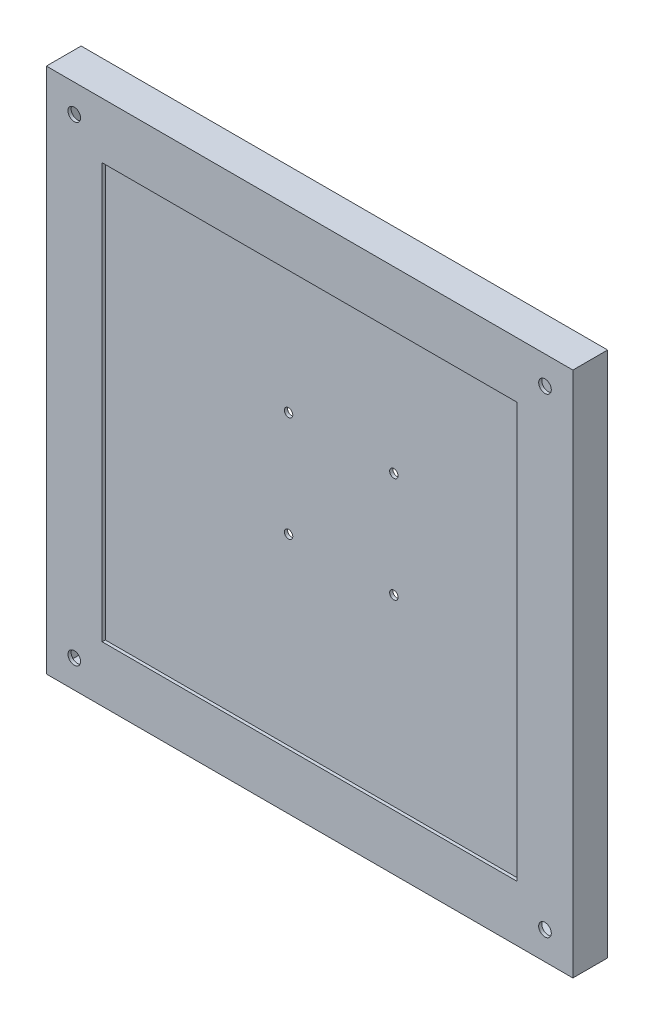
ISO-10303-21;
HEADER;
FILE_DESCRIPTION(('STEP AP214'),'2;1');
FILE_NAME('part.step','',(''),(''),'','','');
FILE_SCHEMA(('AUTOMOTIVE_DESIGN { 1 0 10303 214 1 1 1 1 }'));
ENDSEC;
DATA;
#1=APPLICATION_CONTEXT('core data for automotive mechanical design processes');
#2=APPLICATION_PROTOCOL_DEFINITION('international standard','automotive_design',2000,#1);
#3=PRODUCT_CONTEXT('',#1,'mechanical');
#4=PRODUCT('Part','Part','',(#3));
#5=PRODUCT_RELATED_PRODUCT_CATEGORY('part','',(#4));
#6=PRODUCT_DEFINITION_FORMATION('','',#4);
#7=PRODUCT_DEFINITION_CONTEXT('part definition',#1,'design');
#8=PRODUCT_DEFINITION('design','',#6,#7);
#9=PRODUCT_DEFINITION_SHAPE('','',#8);
#10=(LENGTH_UNIT() NAMED_UNIT(*) SI_UNIT(.MILLI.,.METRE.));
#11=(NAMED_UNIT(*) PLANE_ANGLE_UNIT() SI_UNIT($,.RADIAN.));
#12=(NAMED_UNIT(*) SI_UNIT($,.STERADIAN.) SOLID_ANGLE_UNIT());
#13=UNCERTAINTY_MEASURE_WITH_UNIT(LENGTH_MEASURE(1.E-05),#10,'distance_accuracy_value','');
#14=(GEOMETRIC_REPRESENTATION_CONTEXT(3) GLOBAL_UNCERTAINTY_ASSIGNED_CONTEXT((#13)) GLOBAL_UNIT_ASSIGNED_CONTEXT((#10,
#11,#12)) REPRESENTATION_CONTEXT('',''));
#15=CARTESIAN_POINT('',(0.,0.,0.));
#16=DIRECTION('',(0.,0.,1.));
#17=DIRECTION('',(1.,0.,0.));
#18=AXIS2_PLACEMENT_3D('',#15,#16,#17);
#19=CARTESIAN_POINT('',(-247.,247.,33.));
#20=DIRECTION('',(0.,-1.,0.));
#21=DIRECTION('',(0.,0.,-1.));
#22=AXIS2_PLACEMENT_3D('',#19,#20,#21);
#23=PLANE('',#22);
#24=DIRECTION('',(0.,0.,-1.));
#25=VECTOR('',#24,1.);
#26=CARTESIAN_POINT('',(247.,247.,33.));
#27=LINE('',#26,#25);
#28=CARTESIAN_POINT('',(247.,247.,30.));
#29=VERTEX_POINT('',#28);
#30=CARTESIAN_POINT('',(247.,247.,3.));
#31=VERTEX_POINT('',#30);
#32=EDGE_CURVE('E60',#29,#31,#27,.T.);
#33=ORIENTED_EDGE('',*,*,#32,.F.);
#34=DIRECTION('',(-1.,0.,0.));
#35=VECTOR('',#34,1.);
#36=CARTESIAN_POINT('',(-247.,247.,30.));
#37=LINE('',#36,#35);
#38=CARTESIAN_POINT('',(-247.,247.,30.));
#39=VERTEX_POINT('',#38);
#40=EDGE_CURVE('E53',#29,#39,#37,.T.);
#41=ORIENTED_EDGE('',*,*,#40,.T.);
#42=DIRECTION('',(0.,0.,-1.));
#43=VECTOR('',#42,1.);
#44=CARTESIAN_POINT('',(-247.,247.,33.));
#45=LINE('',#44,#43);
#46=CARTESIAN_POINT('',(-247.,247.,3.));
#47=VERTEX_POINT('',#46);
#48=EDGE_CURVE('E199',#39,#47,#45,.T.);
#49=ORIENTED_EDGE('',*,*,#48,.T.);
#50=DIRECTION('',(-1.,0.,0.));
#51=VECTOR('',#50,1.);
#52=CARTESIAN_POINT('',(-247.,247.,3.));
#53=LINE('',#52,#51);
#54=EDGE_CURVE('E182',#31,#47,#53,.T.);
#55=ORIENTED_EDGE('',*,*,#54,.F.);
#56=EDGE_LOOP('',(#33,#41,#49,#55));
#57=FACE_BOUND('',#56,.T.);
#58=ADVANCED_FACE('F38',(#57),#23,.T.);
#59=CARTESIAN_POINT('',(-247.,247.,33.));
#60=DIRECTION('',(1.,0.,0.));
#61=DIRECTION('',(0.,1.,0.));
#62=AXIS2_PLACEMENT_3D('',#59,#60,#61);
#63=PLANE('',#62);
#64=ORIENTED_EDGE('',*,*,#48,.F.);
#65=DIRECTION('',(0.,-1.,0.));
#66=VECTOR('',#65,1.);
#67=CARTESIAN_POINT('',(-247.,247.,30.));
#68=LINE('',#67,#66);
#69=CARTESIAN_POINT('',(-247.,-247.,30.));
#70=VERTEX_POINT('',#69);
#71=EDGE_CURVE('E170',#39,#70,#68,.T.);
#72=ORIENTED_EDGE('',*,*,#71,.T.);
#73=DIRECTION('',(0.,0.,-1.));
#74=VECTOR('',#73,1.);
#75=CARTESIAN_POINT('',(-247.,-247.,33.));
#76=LINE('',#75,#74);
#77=CARTESIAN_POINT('',(-247.,-247.,3.));
#78=VERTEX_POINT('',#77);
#79=EDGE_CURVE('E197',#70,#78,#76,.T.);
#80=ORIENTED_EDGE('',*,*,#79,.T.);
#81=DIRECTION('',(0.,-1.,0.));
#82=VECTOR('',#81,1.);
#83=CARTESIAN_POINT('',(-247.,247.,3.));
#84=LINE('',#83,#82);
#85=EDGE_CURVE('E185',#47,#78,#84,.T.);
#86=ORIENTED_EDGE('',*,*,#85,.F.);
#87=EDGE_LOOP('',(#64,#72,#80,#86));
#88=FACE_BOUND('',#87,.T.);
#89=ADVANCED_FACE('F279',(#88),#63,.T.);
#90=CARTESIAN_POINT('',(-247.,-247.,33.));
#91=DIRECTION('',(0.,1.,0.));
#92=DIRECTION('',(0.,0.,1.));
#93=AXIS2_PLACEMENT_3D('',#90,#91,#92);
#94=PLANE('',#93);
#95=ORIENTED_EDGE('',*,*,#79,.F.);
#96=DIRECTION('',(1.,0.,0.));
#97=VECTOR('',#96,1.);
#98=CARTESIAN_POINT('',(-247.,-247.,30.));
#99=LINE('',#98,#97);
#100=CARTESIAN_POINT('',(247.,-247.,30.));
#101=VERTEX_POINT('',#100);
#102=EDGE_CURVE('E176',#70,#101,#99,.T.);
#103=ORIENTED_EDGE('',*,*,#102,.T.);
#104=DIRECTION('',(0.,0.,-1.));
#105=VECTOR('',#104,1.);
#106=CARTESIAN_POINT('',(247.,-247.,33.));
#107=LINE('',#106,#105);
#108=CARTESIAN_POINT('',(247.,-247.,3.));
#109=VERTEX_POINT('',#108);
#110=EDGE_CURVE('E195',#101,#109,#107,.T.);
#111=ORIENTED_EDGE('',*,*,#110,.T.);
#112=DIRECTION('',(1.,0.,0.));
#113=VECTOR('',#112,1.);
#114=CARTESIAN_POINT('',(-247.,-247.,3.));
#115=LINE('',#114,#113);
#116=EDGE_CURVE('E188',#78,#109,#115,.T.);
#117=ORIENTED_EDGE('',*,*,#116,.F.);
#118=EDGE_LOOP('',(#95,#103,#111,#117));
#119=FACE_BOUND('',#118,.T.);
#120=ADVANCED_FACE('F285',(#119),#94,.T.);
#121=CARTESIAN_POINT('',(247.,247.,33.));
#122=DIRECTION('',(-1.,0.,0.));
#123=DIRECTION('',(0.,-1.,0.));
#124=AXIS2_PLACEMENT_3D('',#121,#122,#123);
#125=PLANE('',#124);
#126=ORIENTED_EDGE('',*,*,#110,.F.);
#127=DIRECTION('',(0.,1.,0.));
#128=VECTOR('',#127,1.);
#129=CARTESIAN_POINT('',(247.,247.,30.));
#130=LINE('',#129,#128);
#131=EDGE_CURVE('E179',#101,#29,#130,.T.);
#132=ORIENTED_EDGE('',*,*,#131,.T.);
#133=ORIENTED_EDGE('',*,*,#32,.T.);
#134=DIRECTION('',(0.,1.,0.));
#135=VECTOR('',#134,1.);
#136=CARTESIAN_POINT('',(247.,247.,3.));
#137=LINE('',#136,#135);
#138=EDGE_CURVE('E191',#109,#31,#137,.T.);
#139=ORIENTED_EDGE('',*,*,#138,.F.);
#140=EDGE_LOOP('',(#126,#132,#133,#139));
#141=FACE_BOUND('',#140,.T.);
#142=ADVANCED_FACE('F277',(#141),#125,.T.);
#143=CARTESIAN_POINT('',(250.,-250.,3.));
#144=DIRECTION('',(-1.,0.,0.));
#145=DIRECTION('',(0.,0.,1.));
#146=AXIS2_PLACEMENT_3D('',#143,#144,#145);
#147=PLANE('',#146);
#148=DIRECTION('',(0.,1.,0.));
#149=VECTOR('',#148,1.);
#150=CARTESIAN_POINT('',(250.,-250.,0.));
#151=LINE('',#150,#149);
#152=CARTESIAN_POINT('',(250.,-250.,0.));
#153=VERTEX_POINT('',#152);
#154=CARTESIAN_POINT('',(250.,250.,0.));
#155=VERTEX_POINT('',#154);
#156=EDGE_CURVE('E237',#153,#155,#151,.T.);
#157=ORIENTED_EDGE('',*,*,#156,.T.);
#158=DIRECTION('',(0.,0.,-1.));
#159=VECTOR('',#158,1.);
#160=CARTESIAN_POINT('',(250.,250.,3.));
#161=LINE('',#160,#159);
#162=CARTESIAN_POINT('',(250.,250.,33.));
#163=VERTEX_POINT('',#162);
#164=EDGE_CURVE('E11',#163,#155,#161,.T.);
#165=ORIENTED_EDGE('',*,*,#164,.F.);
#166=DIRECTION('',(0.,1.,0.));
#167=VECTOR('',#166,1.);
#168=CARTESIAN_POINT('',(250.,250.,33.));
#169=LINE('',#168,#167);
#170=CARTESIAN_POINT('',(250.,-250.,33.));
#171=VERTEX_POINT('',#170);
#172=EDGE_CURVE('E207',#171,#163,#169,.T.);
#173=ORIENTED_EDGE('',*,*,#172,.F.);
#174=DIRECTION('',(0.,0.,-1.));
#175=VECTOR('',#174,1.);
#176=CARTESIAN_POINT('',(250.,-250.,3.));
#177=LINE('',#176,#175);
#178=EDGE_CURVE('E246',#171,#153,#177,.T.);
#179=ORIENTED_EDGE('',*,*,#178,.T.);
#180=EDGE_LOOP('',(#157,#165,#173,#179));
#181=FACE_BOUND('',#180,.T.);
#182=ADVANCED_FACE('F40',(#181),#147,.F.);
#183=CARTESIAN_POINT('',(-250.,250.,3.));
#184=DIRECTION('',(0.,-1.,0.));
#185=DIRECTION('',(0.,0.,-1.));
#186=AXIS2_PLACEMENT_3D('',#183,#184,#185);
#187=PLANE('',#186);
#188=DIRECTION('',(-1.,0.,0.));
#189=VECTOR('',#188,1.);
#190=CARTESIAN_POINT('',(-250.,250.,0.));
#191=LINE('',#190,#189);
#192=CARTESIAN_POINT('',(-250.,250.,0.));
#193=VERTEX_POINT('',#192);
#194=EDGE_CURVE('E240',#155,#193,#191,.T.);
#195=ORIENTED_EDGE('',*,*,#194,.T.);
#196=DIRECTION('',(0.,0.,-1.));
#197=VECTOR('',#196,1.);
#198=CARTESIAN_POINT('',(-250.,250.,3.));
#199=LINE('',#198,#197);
#200=CARTESIAN_POINT('',(-250.,250.,33.));
#201=VERTEX_POINT('',#200);
#202=EDGE_CURVE('E46',#201,#193,#199,.T.);
#203=ORIENTED_EDGE('',*,*,#202,.F.);
#204=DIRECTION('',(-1.,0.,0.));
#205=VECTOR('',#204,1.);
#206=CARTESIAN_POINT('',(250.,250.,33.));
#207=LINE('',#206,#205);
#208=EDGE_CURVE('E210',#163,#201,#207,.T.);
#209=ORIENTED_EDGE('',*,*,#208,.F.);
#210=ORIENTED_EDGE('',*,*,#164,.T.);
#211=EDGE_LOOP('',(#195,#203,#209,#210));
#212=FACE_BOUND('',#211,.T.);
#213=ADVANCED_FACE('F270',(#212),#187,.F.);
#214=CARTESIAN_POINT('',(-250.,-250.,3.));
#215=DIRECTION('',(1.,0.,0.));
#216=DIRECTION('',(0.,0.,-1.));
#217=AXIS2_PLACEMENT_3D('',#214,#215,#216);
#218=PLANE('',#217);
#219=DIRECTION('',(0.,-1.,0.));
#220=VECTOR('',#219,1.);
#221=CARTESIAN_POINT('',(-250.,-250.,0.));
#222=LINE('',#221,#220);
#223=CARTESIAN_POINT('',(-250.,-250.,0.));
#224=VERTEX_POINT('',#223);
#225=EDGE_CURVE('E242',#193,#224,#222,.T.);
#226=ORIENTED_EDGE('',*,*,#225,.T.);
#227=DIRECTION('',(0.,0.,-1.));
#228=VECTOR('',#227,1.);
#229=CARTESIAN_POINT('',(-250.,-250.,3.));
#230=LINE('',#229,#228);
#231=CARTESIAN_POINT('',(-250.,-250.,33.));
#232=VERTEX_POINT('',#231);
#233=EDGE_CURVE('E249',#232,#224,#230,.T.);
#234=ORIENTED_EDGE('',*,*,#233,.F.);
#235=DIRECTION('',(0.,-1.,0.));
#236=VECTOR('',#235,1.);
#237=CARTESIAN_POINT('',(-250.,250.,33.));
#238=LINE('',#237,#236);
#239=EDGE_CURVE('E201',#201,#232,#238,.T.);
#240=ORIENTED_EDGE('',*,*,#239,.F.);
#241=ORIENTED_EDGE('',*,*,#202,.T.);
#242=EDGE_LOOP('',(#226,#234,#240,#241));
#243=FACE_BOUND('',#242,.T.);
#244=ADVANCED_FACE('F255',(#243),#218,.F.);
#245=CARTESIAN_POINT('',(-250.,-250.,3.));
#246=DIRECTION('',(0.,1.,0.));
#247=DIRECTION('',(0.,0.,1.));
#248=AXIS2_PLACEMENT_3D('',#245,#246,#247);
#249=PLANE('',#248);
#250=DIRECTION('',(1.,0.,0.));
#251=VECTOR('',#250,1.);
#252=CARTESIAN_POINT('',(-250.,-250.,0.));
#253=LINE('',#252,#251);
#254=EDGE_CURVE('E244',#224,#153,#253,.T.);
#255=ORIENTED_EDGE('',*,*,#254,.T.);
#256=ORIENTED_EDGE('',*,*,#178,.F.);
#257=DIRECTION('',(1.,0.,0.));
#258=VECTOR('',#257,1.);
#259=CARTESIAN_POINT('',(250.,-250.,33.));
#260=LINE('',#259,#258);
#261=EDGE_CURVE('E204',#232,#171,#260,.T.);
#262=ORIENTED_EDGE('',*,*,#261,.F.);
#263=ORIENTED_EDGE('',*,*,#233,.T.);
#264=EDGE_LOOP('',(#255,#256,#262,#263));
#265=FACE_BOUND('',#264,.T.);
#266=ADVANCED_FACE('F263',(#265),#249,.F.);
#267=CARTESIAN_POINT('',(0.,0.,3.));
#268=DIRECTION('',(0.,0.,-1.));
#269=DIRECTION('',(-1.,0.,0.));
#270=AXIS2_PLACEMENT_3D('',#267,#268,#269);
#271=PLANE('',#270);
#272=ORIENTED_EDGE('',*,*,#138,.T.);
#273=ORIENTED_EDGE('',*,*,#54,.T.);
#274=ORIENTED_EDGE('',*,*,#85,.T.);
#275=ORIENTED_EDGE('',*,*,#116,.T.);
#276=EDGE_LOOP('',(#272,#273,#274,#275));
#277=FACE_BOUND('',#276,.T.);
#278=CARTESIAN_POINT('',(50.,50.,3.));
#279=DIRECTION('',(0.,0.,-1.));
#280=DIRECTION('',(-1.,0.,0.));
#281=AXIS2_PLACEMENT_3D('',#278,#279,#280);
#282=CIRCLE('',#281,4.00000000000001);
#283=CARTESIAN_POINT('',(46.,50.,3.));
#284=VERTEX_POINT('',#283);
#285=EDGE_CURVE('E223',#284,#284,#282,.F.);
#286=ORIENTED_EDGE('',*,*,#285,.F.);
#287=EDGE_LOOP('',(#286));
#288=FACE_BOUND('',#287,.T.);
#289=CARTESIAN_POINT('',(-50.,-50.,3.));
#290=DIRECTION('',(0.,0.,-1.));
#291=DIRECTION('',(-1.,0.,0.));
#292=AXIS2_PLACEMENT_3D('',#289,#290,#291);
#293=CIRCLE('',#292,4.00000000000001);
#294=CARTESIAN_POINT('',(-54.,-50.,3.));
#295=VERTEX_POINT('',#294);
#296=EDGE_CURVE('E224',#295,#295,#293,.F.);
#297=ORIENTED_EDGE('',*,*,#296,.F.);
#298=EDGE_LOOP('',(#297));
#299=FACE_BOUND('',#298,.T.);
#300=CARTESIAN_POINT('',(50.,-50.,3.));
#301=DIRECTION('',(0.,0.,-1.));
#302=DIRECTION('',(-1.,0.,0.));
#303=AXIS2_PLACEMENT_3D('',#300,#301,#302);
#304=CIRCLE('',#303,4.00000000000001);
#305=CARTESIAN_POINT('',(46.,-50.,3.));
#306=VERTEX_POINT('',#305);
#307=EDGE_CURVE('E216',#306,#306,#304,.F.);
#308=ORIENTED_EDGE('',*,*,#307,.F.);
#309=EDGE_LOOP('',(#308));
#310=FACE_BOUND('',#309,.T.);
#311=CARTESIAN_POINT('',(-50.,50.,3.));
#312=DIRECTION('',(0.,0.,-1.));
#313=DIRECTION('',(-1.,0.,0.));
#314=AXIS2_PLACEMENT_3D('',#311,#312,#313);
#315=CIRCLE('',#314,4.00000000000001);
#316=CARTESIAN_POINT('',(-54.,50.,3.));
#317=VERTEX_POINT('',#316);
#318=EDGE_CURVE('E234',#317,#317,#315,.F.);
#319=ORIENTED_EDGE('',*,*,#318,.F.);
#320=EDGE_LOOP('',(#319));
#321=FACE_BOUND('',#320,.T.);
#322=ADVANCED_FACE('F309',(#277,#288,#299,#310,#321),#271,.F.);
#323=CARTESIAN_POINT('',(0.,0.,0.));
#324=DIRECTION('',(0.,0.,-1.));
#325=DIRECTION('',(-1.,0.,0.));
#326=AXIS2_PLACEMENT_3D('',#323,#324,#325);
#327=PLANE('',#326);
#328=CARTESIAN_POINT('',(50.,50.,0.));
#329=DIRECTION('',(0.,0.,-1.));
#330=DIRECTION('',(1.,0.,0.));
#331=AXIS2_PLACEMENT_3D('',#328,#329,#330);
#332=CIRCLE('',#331,4.00000000000001);
#333=CARTESIAN_POINT('',(46.,50.,0.));
#334=VERTEX_POINT('',#333);
#335=EDGE_CURVE('E220',#334,#334,#332,.T.);
#336=ORIENTED_EDGE('',*,*,#335,.F.);
#337=EDGE_LOOP('',(#336));
#338=FACE_BOUND('',#337,.T.);
#339=CARTESIAN_POINT('',(-50.,-50.,0.));
#340=DIRECTION('',(0.,0.,-1.));
#341=DIRECTION('',(1.,0.,0.));
#342=AXIS2_PLACEMENT_3D('',#339,#340,#341);
#343=CIRCLE('',#342,4.00000000000001);
#344=CARTESIAN_POINT('',(-54.,-50.,0.));
#345=VERTEX_POINT('',#344);
#346=EDGE_CURVE('E219',#345,#345,#343,.T.);
#347=ORIENTED_EDGE('',*,*,#346,.F.);
#348=EDGE_LOOP('',(#347));
#349=FACE_BOUND('',#348,.T.);
#350=CARTESIAN_POINT('',(50.,-50.,0.));
#351=DIRECTION('',(0.,0.,-1.));
#352=DIRECTION('',(-1.,0.,0.));
#353=AXIS2_PLACEMENT_3D('',#350,#351,#352);
#354=CIRCLE('',#353,4.00000000000001);
#355=CARTESIAN_POINT('',(46.,-50.,0.));
#356=VERTEX_POINT('',#355);
#357=EDGE_CURVE('E213',#356,#356,#354,.T.);
#358=ORIENTED_EDGE('',*,*,#357,.F.);
#359=EDGE_LOOP('',(#358));
#360=FACE_BOUND('',#359,.T.);
#361=CARTESIAN_POINT('',(-50.,50.,0.));
#362=DIRECTION('',(0.,0.,-1.));
#363=DIRECTION('',(-1.,0.,0.));
#364=AXIS2_PLACEMENT_3D('',#361,#362,#363);
#365=CIRCLE('',#364,4.00000000000001);
#366=CARTESIAN_POINT('',(-54.,50.,0.));
#367=VERTEX_POINT('',#366);
#368=EDGE_CURVE('E227',#367,#367,#365,.T.);
#369=ORIENTED_EDGE('',*,*,#368,.F.);
#370=EDGE_LOOP('',(#369));
#371=FACE_BOUND('',#370,.T.);
#372=ORIENTED_EDGE('',*,*,#156,.F.);
#373=ORIENTED_EDGE('',*,*,#254,.F.);
#374=ORIENTED_EDGE('',*,*,#225,.F.);
#375=ORIENTED_EDGE('',*,*,#194,.F.);
#376=EDGE_LOOP('',(#372,#373,#374,#375));
#377=FACE_BOUND('',#376,.T.);
#378=ADVANCED_FACE('F261',(#338,#349,#360,#371,#377),#327,.T.);
#379=CARTESIAN_POINT('',(-50.,50.,3.001));
#380=DIRECTION('',(0.,0.,-1.));
#381=DIRECTION('',(-1.,0.,0.));
#382=AXIS2_PLACEMENT_3D('',#379,#380,#381);
#383=CYLINDRICAL_SURFACE('',#382,4.00000000000001);
#384=CARTESIAN_POINT('',(-54.,50.,0.));
#385=CARTESIAN_POINT('',(-54.,50.,0.0312500000000005));
#386=CARTESIAN_POINT('',(-54.,50.,0.0625000000000005));
#387=CARTESIAN_POINT('',(-54.,50.,0.125000000000001));
#388=CARTESIAN_POINT('',(-54.,50.,0.156250000000001));
#389=CARTESIAN_POINT('',(-54.,50.,0.218750000000001));
#390=CARTESIAN_POINT('',(-54.,50.,0.250000000000001));
#391=CARTESIAN_POINT('',(-54.,50.,0.312500000000001));
#392=CARTESIAN_POINT('',(-54.,50.,0.34375));
#393=CARTESIAN_POINT('',(-54.,50.,0.40625));
#394=CARTESIAN_POINT('',(-54.,50.,0.4375));
#395=CARTESIAN_POINT('',(-54.,50.,0.5));
#396=CARTESIAN_POINT('',(-54.,50.,0.53125));
#397=CARTESIAN_POINT('',(-54.,50.,0.593750000000001));
#398=CARTESIAN_POINT('',(-54.,50.,0.625000000000001));
#399=CARTESIAN_POINT('',(-54.,50.,0.687500000000001));
#400=CARTESIAN_POINT('',(-54.,50.,0.71875));
#401=CARTESIAN_POINT('',(-54.,50.,0.78125));
#402=CARTESIAN_POINT('',(-54.,50.,0.8125));
#403=CARTESIAN_POINT('',(-54.,50.,0.875));
#404=CARTESIAN_POINT('',(-54.,50.,0.90625));
#405=CARTESIAN_POINT('',(-54.,50.,0.96875));
#406=CARTESIAN_POINT('',(-54.,50.,1.));
#407=CARTESIAN_POINT('',(-54.,50.,1.0625));
#408=CARTESIAN_POINT('',(-54.,50.,1.09375));
#409=CARTESIAN_POINT('',(-54.,50.,1.15625));
#410=CARTESIAN_POINT('',(-54.,50.,1.1875));
#411=CARTESIAN_POINT('',(-54.,50.,1.25));
#412=CARTESIAN_POINT('',(-54.,50.,1.28125));
#413=CARTESIAN_POINT('',(-54.,50.,1.34375));
#414=CARTESIAN_POINT('',(-54.,50.,1.375));
#415=CARTESIAN_POINT('',(-54.,50.,1.4375));
#416=CARTESIAN_POINT('',(-54.,50.,1.46875));
#417=CARTESIAN_POINT('',(-54.,50.,1.53125));
#418=CARTESIAN_POINT('',(-54.,50.,1.5625));
#419=CARTESIAN_POINT('',(-54.,50.,1.625));
#420=CARTESIAN_POINT('',(-54.,50.,1.65625));
#421=CARTESIAN_POINT('',(-54.,50.,1.71875));
#422=CARTESIAN_POINT('',(-54.,50.,1.75));
#423=CARTESIAN_POINT('',(-54.,50.,1.8125));
#424=CARTESIAN_POINT('',(-54.,50.,1.84375));
#425=CARTESIAN_POINT('',(-54.,50.,1.90625));
#426=CARTESIAN_POINT('',(-54.,50.,1.9375));
#427=CARTESIAN_POINT('',(-54.,50.,2.));
#428=CARTESIAN_POINT('',(-54.,50.,2.03125));
#429=CARTESIAN_POINT('',(-54.,50.,2.09375));
#430=CARTESIAN_POINT('',(-54.,50.,2.125));
#431=CARTESIAN_POINT('',(-54.,50.,2.1875));
#432=CARTESIAN_POINT('',(-54.,50.,2.21875));
#433=CARTESIAN_POINT('',(-54.,50.,2.28125));
#434=CARTESIAN_POINT('',(-54.,50.,2.3125));
#435=CARTESIAN_POINT('',(-54.,50.,2.375));
#436=CARTESIAN_POINT('',(-54.,50.,2.40625));
#437=CARTESIAN_POINT('',(-54.,50.,2.46875));
#438=CARTESIAN_POINT('',(-54.,50.,2.5));
#439=CARTESIAN_POINT('',(-54.,50.,2.5625));
#440=CARTESIAN_POINT('',(-54.,50.,2.59375));
#441=CARTESIAN_POINT('',(-54.,50.,2.65625));
#442=CARTESIAN_POINT('',(-54.,50.,2.6875));
#443=CARTESIAN_POINT('',(-54.,50.,2.75));
#444=CARTESIAN_POINT('',(-54.,50.,2.78125));
#445=CARTESIAN_POINT('',(-54.,50.,2.84375));
#446=CARTESIAN_POINT('',(-54.,50.,2.875));
#447=CARTESIAN_POINT('',(-54.,50.,2.9375));
#448=CARTESIAN_POINT('',(-54.,50.,2.96875));
#449=CARTESIAN_POINT('',(-54.,50.,3.));
#450=B_SPLINE_CURVE_WITH_KNOTS('',3,(#384,#385,#386,#387,#388,#389,#390,#391,#392,#393,#394,
#395,#396,#397,#398,#399,#400,#401,#402,#403,#404,#405,#406,#407,#408,#409,#410,#411,#412,#413,
#414,#415,#416,#417,#418,#419,#420,#421,#422,#423,#424,#425,#426,#427,#428,#429,#430,#431,#432,
#433,#434,#435,#436,#437,#438,#439,#440,#441,#442,#443,#444,#445,#446,#447,#448,#449),
.UNSPECIFIED.,.F.,.F.,(4,2,2,2,2,2,2,2,2,2,2,2,2,2,2,2,2,2,2,2,2,2,2,2,2,2,2,2,2,2,2,2,4),(0.,
0.0937500000000001,0.1875,0.28125,0.375,0.46875,0.5625,0.65625,0.75,0.84375,0.9375,1.03125,
1.125,1.21875,1.3125,1.40625,1.5,1.59375,1.6875,1.78125,1.875,1.96875,2.0625,2.15625,2.25,
2.34375,2.4375,2.53125,2.625,2.71875,2.8125,2.90625,3.),.UNSPECIFIED.);
#451=EDGE_CURVE('BSEAM298',#367,#317,#450,.T.);
#452=ORIENTED_EDGE('',*,*,#368,.T.);
#453=ORIENTED_EDGE('',*,*,#318,.T.);
#454=ORIENTED_EDGE('',*,*,#451,.T.);
#455=ORIENTED_EDGE('',*,*,#451,.F.);
#456=EDGE_LOOP('',(#452,#454,#453,#455));
#457=FACE_BOUND('',#456,.T.);
#458=ADVANCED_FACE('F298',(#457),#383,.F.);
#459=CARTESIAN_POINT('',(50.,-50.,3.001));
#460=DIRECTION('',(0.,0.,-1.));
#461=DIRECTION('',(-1.,0.,0.));
#462=AXIS2_PLACEMENT_3D('',#459,#460,#461);
#463=CYLINDRICAL_SURFACE('',#462,4.00000000000001);
#464=CARTESIAN_POINT('',(46.,-50.,0.));
#465=CARTESIAN_POINT('',(46.,-50.,0.0312500000000005));
#466=CARTESIAN_POINT('',(46.,-50.,0.0625000000000005));
#467=CARTESIAN_POINT('',(46.,-50.,0.125000000000001));
#468=CARTESIAN_POINT('',(46.,-50.,0.156250000000001));
#469=CARTESIAN_POINT('',(46.,-50.,0.218750000000001));
#470=CARTESIAN_POINT('',(46.,-50.,0.250000000000001));
#471=CARTESIAN_POINT('',(46.,-50.,0.312500000000001));
#472=CARTESIAN_POINT('',(46.,-50.,0.34375));
#473=CARTESIAN_POINT('',(46.,-50.,0.40625));
#474=CARTESIAN_POINT('',(46.,-50.,0.4375));
#475=CARTESIAN_POINT('',(46.,-50.,0.5));
#476=CARTESIAN_POINT('',(46.,-50.,0.53125));
#477=CARTESIAN_POINT('',(46.,-50.,0.593750000000001));
#478=CARTESIAN_POINT('',(46.,-50.,0.625000000000001));
#479=CARTESIAN_POINT('',(46.,-50.,0.687500000000001));
#480=CARTESIAN_POINT('',(46.,-50.,0.71875));
#481=CARTESIAN_POINT('',(46.,-50.,0.78125));
#482=CARTESIAN_POINT('',(46.,-50.,0.8125));
#483=CARTESIAN_POINT('',(46.,-50.,0.875));
#484=CARTESIAN_POINT('',(46.,-50.,0.90625));
#485=CARTESIAN_POINT('',(46.,-50.,0.96875));
#486=CARTESIAN_POINT('',(46.,-50.,1.));
#487=CARTESIAN_POINT('',(46.,-50.,1.0625));
#488=CARTESIAN_POINT('',(46.,-50.,1.09375));
#489=CARTESIAN_POINT('',(46.,-50.,1.15625));
#490=CARTESIAN_POINT('',(46.,-50.,1.1875));
#491=CARTESIAN_POINT('',(46.,-50.,1.25));
#492=CARTESIAN_POINT('',(46.,-50.,1.28125));
#493=CARTESIAN_POINT('',(46.,-50.,1.34375));
#494=CARTESIAN_POINT('',(46.,-50.,1.375));
#495=CARTESIAN_POINT('',(46.,-50.,1.4375));
#496=CARTESIAN_POINT('',(46.,-50.,1.46875));
#497=CARTESIAN_POINT('',(46.,-50.,1.53125));
#498=CARTESIAN_POINT('',(46.,-50.,1.5625));
#499=CARTESIAN_POINT('',(46.,-50.,1.625));
#500=CARTESIAN_POINT('',(46.,-50.,1.65625));
#501=CARTESIAN_POINT('',(46.,-50.,1.71875));
#502=CARTESIAN_POINT('',(46.,-50.,1.75));
#503=CARTESIAN_POINT('',(46.,-50.,1.8125));
#504=CARTESIAN_POINT('',(46.,-50.,1.84375));
#505=CARTESIAN_POINT('',(46.,-50.,1.90625));
#506=CARTESIAN_POINT('',(46.,-50.,1.9375));
#507=CARTESIAN_POINT('',(46.,-50.,2.));
#508=CARTESIAN_POINT('',(46.,-50.,2.03125));
#509=CARTESIAN_POINT('',(46.,-50.,2.09375));
#510=CARTESIAN_POINT('',(46.,-50.,2.125));
#511=CARTESIAN_POINT('',(46.,-50.,2.1875));
#512=CARTESIAN_POINT('',(46.,-50.,2.21875));
#513=CARTESIAN_POINT('',(46.,-50.,2.28125));
#514=CARTESIAN_POINT('',(46.,-50.,2.3125));
#515=CARTESIAN_POINT('',(46.,-50.,2.375));
#516=CARTESIAN_POINT('',(46.,-50.,2.40625));
#517=CARTESIAN_POINT('',(46.,-50.,2.46875));
#518=CARTESIAN_POINT('',(46.,-50.,2.5));
#519=CARTESIAN_POINT('',(46.,-50.,2.5625));
#520=CARTESIAN_POINT('',(46.,-50.,2.59375));
#521=CARTESIAN_POINT('',(46.,-50.,2.65625));
#522=CARTESIAN_POINT('',(46.,-50.,2.6875));
#523=CARTESIAN_POINT('',(46.,-50.,2.75));
#524=CARTESIAN_POINT('',(46.,-50.,2.78125));
#525=CARTESIAN_POINT('',(46.,-50.,2.84375));
#526=CARTESIAN_POINT('',(46.,-50.,2.875));
#527=CARTESIAN_POINT('',(46.,-50.,2.9375));
#528=CARTESIAN_POINT('',(46.,-50.,2.96875));
#529=CARTESIAN_POINT('',(46.,-50.,3.));
#530=B_SPLINE_CURVE_WITH_KNOTS('',3,(#464,#465,#466,#467,#468,#469,#470,#471,#472,#473,#474,
#475,#476,#477,#478,#479,#480,#481,#482,#483,#484,#485,#486,#487,#488,#489,#490,#491,#492,#493,
#494,#495,#496,#497,#498,#499,#500,#501,#502,#503,#504,#505,#506,#507,#508,#509,#510,#511,#512,
#513,#514,#515,#516,#517,#518,#519,#520,#521,#522,#523,#524,#525,#526,#527,#528,#529),
.UNSPECIFIED.,.F.,.F.,(4,2,2,2,2,2,2,2,2,2,2,2,2,2,2,2,2,2,2,2,2,2,2,2,2,2,2,2,2,2,2,2,4),(0.,
0.0937500000000001,0.1875,0.28125,0.375,0.46875,0.5625,0.65625,0.75,0.84375,0.9375,1.03125,
1.125,1.21875,1.3125,1.40625,1.5,1.59375,1.6875,1.78125,1.875,1.96875,2.0625,2.15625,2.25,
2.34375,2.4375,2.53125,2.625,2.71875,2.8125,2.90625,3.),.UNSPECIFIED.);
#531=EDGE_CURVE('BSEAM294',#356,#306,#530,.T.);
#532=ORIENTED_EDGE('',*,*,#357,.T.);
#533=ORIENTED_EDGE('',*,*,#307,.T.);
#534=ORIENTED_EDGE('',*,*,#531,.T.);
#535=ORIENTED_EDGE('',*,*,#531,.F.);
#536=EDGE_LOOP('',(#532,#534,#533,#535));
#537=FACE_BOUND('',#536,.T.);
#538=ADVANCED_FACE('F294',(#537),#463,.F.);
#539=CARTESIAN_POINT('',(-50.,-50.,3.001));
#540=DIRECTION('',(0.,0.,-1.));
#541=DIRECTION('',(-1.,0.,0.));
#542=AXIS2_PLACEMENT_3D('',#539,#540,#541);
#543=CYLINDRICAL_SURFACE('',#542,4.00000000000001);
#544=CARTESIAN_POINT('',(-54.,-50.,0.));
#545=CARTESIAN_POINT('',(-54.,-50.,0.0312500000000005));
#546=CARTESIAN_POINT('',(-54.,-50.,0.0625000000000005));
#547=CARTESIAN_POINT('',(-54.,-50.,0.125000000000001));
#548=CARTESIAN_POINT('',(-54.,-50.,0.156250000000001));
#549=CARTESIAN_POINT('',(-54.,-50.,0.218750000000001));
#550=CARTESIAN_POINT('',(-54.,-50.,0.250000000000001));
#551=CARTESIAN_POINT('',(-54.,-50.,0.312500000000001));
#552=CARTESIAN_POINT('',(-54.,-50.,0.34375));
#553=CARTESIAN_POINT('',(-54.,-50.,0.40625));
#554=CARTESIAN_POINT('',(-54.,-50.,0.4375));
#555=CARTESIAN_POINT('',(-54.,-50.,0.5));
#556=CARTESIAN_POINT('',(-54.,-50.,0.53125));
#557=CARTESIAN_POINT('',(-54.,-50.,0.593750000000001));
#558=CARTESIAN_POINT('',(-54.,-50.,0.625000000000001));
#559=CARTESIAN_POINT('',(-54.,-50.,0.687500000000001));
#560=CARTESIAN_POINT('',(-54.,-50.,0.71875));
#561=CARTESIAN_POINT('',(-54.,-50.,0.78125));
#562=CARTESIAN_POINT('',(-54.,-50.,0.8125));
#563=CARTESIAN_POINT('',(-54.,-50.,0.875));
#564=CARTESIAN_POINT('',(-54.,-50.,0.90625));
#565=CARTESIAN_POINT('',(-54.,-50.,0.96875));
#566=CARTESIAN_POINT('',(-54.,-50.,1.));
#567=CARTESIAN_POINT('',(-54.,-50.,1.0625));
#568=CARTESIAN_POINT('',(-54.,-50.,1.09375));
#569=CARTESIAN_POINT('',(-54.,-50.,1.15625));
#570=CARTESIAN_POINT('',(-54.,-50.,1.1875));
#571=CARTESIAN_POINT('',(-54.,-50.,1.25));
#572=CARTESIAN_POINT('',(-54.,-50.,1.28125));
#573=CARTESIAN_POINT('',(-54.,-50.,1.34375));
#574=CARTESIAN_POINT('',(-54.,-50.,1.375));
#575=CARTESIAN_POINT('',(-54.,-50.,1.4375));
#576=CARTESIAN_POINT('',(-54.,-50.,1.46875));
#577=CARTESIAN_POINT('',(-54.,-50.,1.53125));
#578=CARTESIAN_POINT('',(-54.,-50.,1.5625));
#579=CARTESIAN_POINT('',(-54.,-50.,1.625));
#580=CARTESIAN_POINT('',(-54.,-50.,1.65625));
#581=CARTESIAN_POINT('',(-54.,-50.,1.71875));
#582=CARTESIAN_POINT('',(-54.,-50.,1.75));
#583=CARTESIAN_POINT('',(-54.,-50.,1.8125));
#584=CARTESIAN_POINT('',(-54.,-50.,1.84375));
#585=CARTESIAN_POINT('',(-54.,-50.,1.90625));
#586=CARTESIAN_POINT('',(-54.,-50.,1.9375));
#587=CARTESIAN_POINT('',(-54.,-50.,2.));
#588=CARTESIAN_POINT('',(-54.,-50.,2.03125));
#589=CARTESIAN_POINT('',(-54.,-50.,2.09375));
#590=CARTESIAN_POINT('',(-54.,-50.,2.125));
#591=CARTESIAN_POINT('',(-54.,-50.,2.1875));
#592=CARTESIAN_POINT('',(-54.,-50.,2.21875));
#593=CARTESIAN_POINT('',(-54.,-50.,2.28125));
#594=CARTESIAN_POINT('',(-54.,-50.,2.3125));
#595=CARTESIAN_POINT('',(-54.,-50.,2.375));
#596=CARTESIAN_POINT('',(-54.,-50.,2.40625));
#597=CARTESIAN_POINT('',(-54.,-50.,2.46875));
#598=CARTESIAN_POINT('',(-54.,-50.,2.5));
#599=CARTESIAN_POINT('',(-54.,-50.,2.5625));
#600=CARTESIAN_POINT('',(-54.,-50.,2.59375));
#601=CARTESIAN_POINT('',(-54.,-50.,2.65625));
#602=CARTESIAN_POINT('',(-54.,-50.,2.6875));
#603=CARTESIAN_POINT('',(-54.,-50.,2.75));
#604=CARTESIAN_POINT('',(-54.,-50.,2.78125));
#605=CARTESIAN_POINT('',(-54.,-50.,2.84375));
#606=CARTESIAN_POINT('',(-54.,-50.,2.875));
#607=CARTESIAN_POINT('',(-54.,-50.,2.9375));
#608=CARTESIAN_POINT('',(-54.,-50.,2.96875));
#609=CARTESIAN_POINT('',(-54.,-50.,3.));
#610=B_SPLINE_CURVE_WITH_KNOTS('',3,(#544,#545,#546,#547,#548,#549,#550,#551,#552,#553,#554,
#555,#556,#557,#558,#559,#560,#561,#562,#563,#564,#565,#566,#567,#568,#569,#570,#571,#572,#573,
#574,#575,#576,#577,#578,#579,#580,#581,#582,#583,#584,#585,#586,#587,#588,#589,#590,#591,#592,
#593,#594,#595,#596,#597,#598,#599,#600,#601,#602,#603,#604,#605,#606,#607,#608,#609),
.UNSPECIFIED.,.F.,.F.,(4,2,2,2,2,2,2,2,2,2,2,2,2,2,2,2,2,2,2,2,2,2,2,2,2,2,2,2,2,2,2,2,4),(0.,
0.0937500000000001,0.1875,0.28125,0.375,0.46875,0.5625,0.65625,0.75,0.84375,0.9375,1.03125,
1.125,1.21875,1.3125,1.40625,1.5,1.59375,1.6875,1.78125,1.875,1.96875,2.0625,2.15625,2.25,
2.34375,2.4375,2.53125,2.625,2.71875,2.8125,2.90625,3.),.UNSPECIFIED.);
#611=EDGE_CURVE('BSEAM297',#345,#295,#610,.T.);
#612=ORIENTED_EDGE('',*,*,#346,.T.);
#613=ORIENTED_EDGE('',*,*,#296,.T.);
#614=ORIENTED_EDGE('',*,*,#611,.T.);
#615=ORIENTED_EDGE('',*,*,#611,.F.);
#616=EDGE_LOOP('',(#612,#614,#613,#615));
#617=FACE_BOUND('',#616,.T.);
#618=ADVANCED_FACE('F297',(#617),#543,.F.);
#619=CARTESIAN_POINT('',(50.,50.,3.001));
#620=DIRECTION('',(0.,0.,-1.));
#621=DIRECTION('',(-1.,0.,0.));
#622=AXIS2_PLACEMENT_3D('',#619,#620,#621);
#623=CYLINDRICAL_SURFACE('',#622,4.00000000000001);
#624=CARTESIAN_POINT('',(46.,50.,0.));
#625=CARTESIAN_POINT('',(46.,50.,0.0312500000000005));
#626=CARTESIAN_POINT('',(46.,50.,0.0625000000000005));
#627=CARTESIAN_POINT('',(46.,50.,0.125000000000001));
#628=CARTESIAN_POINT('',(46.,50.,0.156250000000001));
#629=CARTESIAN_POINT('',(46.,50.,0.218750000000001));
#630=CARTESIAN_POINT('',(46.,50.,0.250000000000001));
#631=CARTESIAN_POINT('',(46.,50.,0.312500000000001));
#632=CARTESIAN_POINT('',(46.,50.,0.34375));
#633=CARTESIAN_POINT('',(46.,50.,0.40625));
#634=CARTESIAN_POINT('',(46.,50.,0.4375));
#635=CARTESIAN_POINT('',(46.,50.,0.5));
#636=CARTESIAN_POINT('',(46.,50.,0.53125));
#637=CARTESIAN_POINT('',(46.,50.,0.593750000000001));
#638=CARTESIAN_POINT('',(46.,50.,0.625000000000001));
#639=CARTESIAN_POINT('',(46.,50.,0.687500000000001));
#640=CARTESIAN_POINT('',(46.,50.,0.71875));
#641=CARTESIAN_POINT('',(46.,50.,0.78125));
#642=CARTESIAN_POINT('',(46.,50.,0.8125));
#643=CARTESIAN_POINT('',(46.,50.,0.875));
#644=CARTESIAN_POINT('',(46.,50.,0.90625));
#645=CARTESIAN_POINT('',(46.,50.,0.96875));
#646=CARTESIAN_POINT('',(46.,50.,1.));
#647=CARTESIAN_POINT('',(46.,50.,1.0625));
#648=CARTESIAN_POINT('',(46.,50.,1.09375));
#649=CARTESIAN_POINT('',(46.,50.,1.15625));
#650=CARTESIAN_POINT('',(46.,50.,1.1875));
#651=CARTESIAN_POINT('',(46.,50.,1.25));
#652=CARTESIAN_POINT('',(46.,50.,1.28125));
#653=CARTESIAN_POINT('',(46.,50.,1.34375));
#654=CARTESIAN_POINT('',(46.,50.,1.375));
#655=CARTESIAN_POINT('',(46.,50.,1.4375));
#656=CARTESIAN_POINT('',(46.,50.,1.46875));
#657=CARTESIAN_POINT('',(46.,50.,1.53125));
#658=CARTESIAN_POINT('',(46.,50.,1.5625));
#659=CARTESIAN_POINT('',(46.,50.,1.625));
#660=CARTESIAN_POINT('',(46.,50.,1.65625));
#661=CARTESIAN_POINT('',(46.,50.,1.71875));
#662=CARTESIAN_POINT('',(46.,50.,1.75));
#663=CARTESIAN_POINT('',(46.,50.,1.8125));
#664=CARTESIAN_POINT('',(46.,50.,1.84375));
#665=CARTESIAN_POINT('',(46.,50.,1.90625));
#666=CARTESIAN_POINT('',(46.,50.,1.9375));
#667=CARTESIAN_POINT('',(46.,50.,2.));
#668=CARTESIAN_POINT('',(46.,50.,2.03125));
#669=CARTESIAN_POINT('',(46.,50.,2.09375));
#670=CARTESIAN_POINT('',(46.,50.,2.125));
#671=CARTESIAN_POINT('',(46.,50.,2.1875));
#672=CARTESIAN_POINT('',(46.,50.,2.21875));
#673=CARTESIAN_POINT('',(46.,50.,2.28125));
#674=CARTESIAN_POINT('',(46.,50.,2.3125));
#675=CARTESIAN_POINT('',(46.,50.,2.375));
#676=CARTESIAN_POINT('',(46.,50.,2.40625));
#677=CARTESIAN_POINT('',(46.,50.,2.46875));
#678=CARTESIAN_POINT('',(46.,50.,2.5));
#679=CARTESIAN_POINT('',(46.,50.,2.5625));
#680=CARTESIAN_POINT('',(46.,50.,2.59375));
#681=CARTESIAN_POINT('',(46.,50.,2.65625));
#682=CARTESIAN_POINT('',(46.,50.,2.6875));
#683=CARTESIAN_POINT('',(46.,50.,2.75));
#684=CARTESIAN_POINT('',(46.,50.,2.78125));
#685=CARTESIAN_POINT('',(46.,50.,2.84375));
#686=CARTESIAN_POINT('',(46.,50.,2.875));
#687=CARTESIAN_POINT('',(46.,50.,2.9375));
#688=CARTESIAN_POINT('',(46.,50.,2.96875));
#689=CARTESIAN_POINT('',(46.,50.,3.));
#690=B_SPLINE_CURVE_WITH_KNOTS('',3,(#624,#625,#626,#627,#628,#629,#630,#631,#632,#633,#634,
#635,#636,#637,#638,#639,#640,#641,#642,#643,#644,#645,#646,#647,#648,#649,#650,#651,#652,#653,
#654,#655,#656,#657,#658,#659,#660,#661,#662,#663,#664,#665,#666,#667,#668,#669,#670,#671,#672,
#673,#674,#675,#676,#677,#678,#679,#680,#681,#682,#683,#684,#685,#686,#687,#688,#689),
.UNSPECIFIED.,.F.,.F.,(4,2,2,2,2,2,2,2,2,2,2,2,2,2,2,2,2,2,2,2,2,2,2,2,2,2,2,2,2,2,2,2,4),(0.,
0.0937500000000001,0.1875,0.28125,0.375,0.46875,0.5625,0.65625,0.75,0.84375,0.9375,1.03125,
1.125,1.21875,1.3125,1.40625,1.5,1.59375,1.6875,1.78125,1.875,1.96875,2.0625,2.15625,2.25,
2.34375,2.4375,2.53125,2.625,2.71875,2.8125,2.90625,3.),.UNSPECIFIED.);
#691=EDGE_CURVE('BSEAM292',#334,#284,#690,.T.);
#692=ORIENTED_EDGE('',*,*,#335,.T.);
#693=ORIENTED_EDGE('',*,*,#285,.T.);
#694=ORIENTED_EDGE('',*,*,#691,.T.);
#695=ORIENTED_EDGE('',*,*,#691,.F.);
#696=EDGE_LOOP('',(#692,#694,#693,#695));
#697=FACE_BOUND('',#696,.T.);
#698=ADVANCED_FACE('F292',(#697),#623,.F.);
#699=CARTESIAN_POINT('',(0.,0.,33.));
#700=DIRECTION('',(0.,0.,-1.));
#701=DIRECTION('',(-1.,0.,0.));
#702=AXIS2_PLACEMENT_3D('',#699,#700,#701);
#703=PLANE('',#702);
#704=CARTESIAN_POINT('',(-223.5,-223.5,33.));
#705=DIRECTION('',(0.,0.,1.));
#706=DIRECTION('',(-1.,0.,0.));
#707=AXIS2_PLACEMENT_3D('',#704,#705,#706);
#708=CIRCLE('',#707,6.00000000000002);
#709=CARTESIAN_POINT('',(-229.5,-223.5,33.));
#710=VERTEX_POINT('',#709);
#711=EDGE_CURVE('E527',#710,#710,#708,.T.);
#712=ORIENTED_EDGE('',*,*,#711,.F.);
#713=EDGE_LOOP('',(#712));
#714=FACE_BOUND('',#713,.T.);
#715=CARTESIAN_POINT('',(223.5,-223.5,33.));
#716=DIRECTION('',(0.,0.,1.));
#717=DIRECTION('',(1.,0.,0.));
#718=AXIS2_PLACEMENT_3D('',#715,#716,#717);
#719=CIRCLE('',#718,6.00000000000002);
#720=CARTESIAN_POINT('',(229.5,-223.5,33.));
#721=VERTEX_POINT('',#720);
#722=EDGE_CURVE('E531',#721,#721,#719,.T.);
#723=ORIENTED_EDGE('',*,*,#722,.F.);
#724=EDGE_LOOP('',(#723));
#725=FACE_BOUND('',#724,.T.);
#726=CARTESIAN_POINT('',(223.5,223.5,33.));
#727=DIRECTION('',(0.,0.,1.));
#728=DIRECTION('',(-1.,0.,0.));
#729=AXIS2_PLACEMENT_3D('',#726,#727,#728);
#730=CIRCLE('',#729,6.00000000000002);
#731=CARTESIAN_POINT('',(217.5,223.5,33.));
#732=VERTEX_POINT('',#731);
#733=EDGE_CURVE('E544',#732,#732,#730,.T.);
#734=ORIENTED_EDGE('',*,*,#733,.F.);
#735=EDGE_LOOP('',(#734));
#736=FACE_BOUND('',#735,.T.);
#737=CARTESIAN_POINT('',(-223.5,223.5,33.));
#738=DIRECTION('',(0.,0.,1.));
#739=DIRECTION('',(1.,0.,0.));
#740=AXIS2_PLACEMENT_3D('',#737,#738,#739);
#741=CIRCLE('',#740,6.00000000000002);
#742=CARTESIAN_POINT('',(-217.5,223.5,33.));
#743=VERTEX_POINT('',#742);
#744=EDGE_CURVE('E538',#743,#743,#741,.T.);
#745=ORIENTED_EDGE('',*,*,#744,.F.);
#746=EDGE_LOOP('',(#745));
#747=FACE_BOUND('',#746,.T.);
#748=ORIENTED_EDGE('',*,*,#239,.T.);
#749=ORIENTED_EDGE('',*,*,#261,.T.);
#750=ORIENTED_EDGE('',*,*,#172,.T.);
#751=ORIENTED_EDGE('',*,*,#208,.T.);
#752=EDGE_LOOP('',(#748,#749,#750,#751));
#753=FACE_BOUND('',#752,.T.);
#754=DIRECTION('',(-1.,0.,0.));
#755=VECTOR('',#754,1.);
#756=CARTESIAN_POINT('',(-197.,197.,33.));
#757=LINE('',#756,#755);
#758=CARTESIAN_POINT('',(197.,197.,33.));
#759=VERTEX_POINT('',#758);
#760=CARTESIAN_POINT('',(-197.,197.,33.));
#761=VERTEX_POINT('',#760);
#762=EDGE_CURVE('E135',#759,#761,#757,.T.);
#763=ORIENTED_EDGE('',*,*,#762,.F.);
#764=DIRECTION('',(0.,1.,0.));
#765=VECTOR('',#764,1.);
#766=CARTESIAN_POINT('',(197.,197.,33.));
#767=LINE('',#766,#765);
#768=CARTESIAN_POINT('',(197.,-197.,33.));
#769=VERTEX_POINT('',#768);
#770=EDGE_CURVE('E152',#769,#759,#767,.T.);
#771=ORIENTED_EDGE('',*,*,#770,.F.);
#772=DIRECTION('',(1.,0.,0.));
#773=VECTOR('',#772,1.);
#774=CARTESIAN_POINT('',(-197.,-197.,33.));
#775=LINE('',#774,#773);
#776=CARTESIAN_POINT('',(-197.,-197.,33.));
#777=VERTEX_POINT('',#776);
#778=EDGE_CURVE('E155',#777,#769,#775,.T.);
#779=ORIENTED_EDGE('',*,*,#778,.F.);
#780=DIRECTION('',(0.,-1.,0.));
#781=VECTOR('',#780,1.);
#782=CARTESIAN_POINT('',(-197.,197.,33.));
#783=LINE('',#782,#781);
#784=EDGE_CURVE('E164',#761,#777,#783,.T.);
#785=ORIENTED_EDGE('',*,*,#784,.F.);
#786=EDGE_LOOP('',(#763,#771,#779,#785));
#787=FACE_BOUND('',#786,.T.);
#788=ADVANCED_FACE('F268',(#714,#725,#736,#747,#753,#787),#703,.F.);
#789=CARTESIAN_POINT('',(0.,0.,30.));
#790=DIRECTION('',(0.,0.,1.));
#791=DIRECTION('',(1.,0.,0.));
#792=AXIS2_PLACEMENT_3D('',#789,#790,#791);
#793=PLANE('',#792);
#794=CARTESIAN_POINT('',(-223.5,-223.5,30.));
#795=DIRECTION('',(0.,0.,1.));
#796=DIRECTION('',(1.,0.,0.));
#797=AXIS2_PLACEMENT_3D('',#794,#795,#796);
#798=CIRCLE('',#797,6.00000000000002);
#799=CARTESIAN_POINT('',(-217.5,-223.5,30.));
#800=VERTEX_POINT('',#799);
#801=EDGE_CURVE('E530',#800,#800,#798,.F.);
#802=ORIENTED_EDGE('',*,*,#801,.F.);
#803=EDGE_LOOP('',(#802));
#804=FACE_BOUND('',#803,.T.);
#805=CARTESIAN_POINT('',(223.5,-223.5,30.));
#806=DIRECTION('',(0.,0.,1.));
#807=DIRECTION('',(1.,0.,0.));
#808=AXIS2_PLACEMENT_3D('',#805,#806,#807);
#809=CIRCLE('',#808,6.00000000000002);
#810=CARTESIAN_POINT('',(229.5,-223.5,30.));
#811=VERTEX_POINT('',#810);
#812=EDGE_CURVE('E534',#811,#811,#809,.F.);
#813=ORIENTED_EDGE('',*,*,#812,.F.);
#814=EDGE_LOOP('',(#813));
#815=FACE_BOUND('',#814,.T.);
#816=CARTESIAN_POINT('',(223.5,223.5,30.));
#817=DIRECTION('',(0.,0.,1.));
#818=DIRECTION('',(1.,0.,0.));
#819=AXIS2_PLACEMENT_3D('',#816,#817,#818);
#820=CIRCLE('',#819,6.00000000000002);
#821=CARTESIAN_POINT('',(229.5,223.5,30.));
#822=VERTEX_POINT('',#821);
#823=EDGE_CURVE('E540',#822,#822,#820,.F.);
#824=ORIENTED_EDGE('',*,*,#823,.F.);
#825=EDGE_LOOP('',(#824));
#826=FACE_BOUND('',#825,.T.);
#827=CARTESIAN_POINT('',(-223.5,223.5,30.));
#828=DIRECTION('',(0.,0.,1.));
#829=DIRECTION('',(1.,0.,0.));
#830=AXIS2_PLACEMENT_3D('',#827,#828,#829);
#831=CIRCLE('',#830,6.00000000000002);
#832=CARTESIAN_POINT('',(-217.5,223.5,30.));
#833=VERTEX_POINT('',#832);
#834=EDGE_CURVE('E158',#833,#833,#831,.F.);
#835=ORIENTED_EDGE('',*,*,#834,.F.);
#836=EDGE_LOOP('',(#835));
#837=FACE_BOUND('',#836,.T.);
#838=DIRECTION('',(0.,1.,0.));
#839=VECTOR('',#838,1.);
#840=CARTESIAN_POINT('',(197.,197.,30.));
#841=LINE('',#840,#839);
#842=CARTESIAN_POINT('',(197.,-197.,30.));
#843=VERTEX_POINT('',#842);
#844=CARTESIAN_POINT('',(197.,197.,30.));
#845=VERTEX_POINT('',#844);
#846=EDGE_CURVE('E140',#843,#845,#841,.T.);
#847=ORIENTED_EDGE('',*,*,#846,.T.);
#848=DIRECTION('',(-1.,0.,0.));
#849=VECTOR('',#848,1.);
#850=CARTESIAN_POINT('',(-197.,197.,30.));
#851=LINE('',#850,#849);
#852=CARTESIAN_POINT('',(-197.,197.,30.));
#853=VERTEX_POINT('',#852);
#854=EDGE_CURVE('E132',#845,#853,#851,.T.);
#855=ORIENTED_EDGE('',*,*,#854,.T.);
#856=DIRECTION('',(0.,-1.,0.));
#857=VECTOR('',#856,1.);
#858=CARTESIAN_POINT('',(-197.,197.,30.));
#859=LINE('',#858,#857);
#860=CARTESIAN_POINT('',(-197.,-197.,30.));
#861=VERTEX_POINT('',#860);
#862=EDGE_CURVE('E144',#853,#861,#859,.T.);
#863=ORIENTED_EDGE('',*,*,#862,.T.);
#864=DIRECTION('',(1.,0.,0.));
#865=VECTOR('',#864,1.);
#866=CARTESIAN_POINT('',(-197.,-197.,30.));
#867=LINE('',#866,#865);
#868=EDGE_CURVE('E148',#861,#843,#867,.T.);
#869=ORIENTED_EDGE('',*,*,#868,.T.);
#870=EDGE_LOOP('',(#847,#855,#863,#869));
#871=FACE_BOUND('',#870,.T.);
#872=ORIENTED_EDGE('',*,*,#71,.F.);
#873=ORIENTED_EDGE('',*,*,#40,.F.);
#874=ORIENTED_EDGE('',*,*,#131,.F.);
#875=ORIENTED_EDGE('',*,*,#102,.F.);
#876=EDGE_LOOP('',(#872,#873,#874,#875));
#877=FACE_BOUND('',#876,.T.);
#878=ADVANCED_FACE('F150',(#804,#815,#826,#837,#871,#877),#793,.F.);
#879=CARTESIAN_POINT('',(-197.,197.,30.));
#880=DIRECTION('',(0.,1.,0.));
#881=DIRECTION('',(0.,0.,1.));
#882=AXIS2_PLACEMENT_3D('',#879,#880,#881);
#883=PLANE('',#882);
#884=ORIENTED_EDGE('',*,*,#762,.T.);
#885=DIRECTION('',(0.,0.,1.));
#886=VECTOR('',#885,1.);
#887=CARTESIAN_POINT('',(-197.,197.,30.));
#888=LINE('',#887,#886);
#889=EDGE_CURVE('E128',#853,#761,#888,.T.);
#890=ORIENTED_EDGE('',*,*,#889,.F.);
#891=ORIENTED_EDGE('',*,*,#854,.F.);
#892=DIRECTION('',(0.,0.,1.));
#893=VECTOR('',#892,1.);
#894=CARTESIAN_POINT('',(197.,197.,30.));
#895=LINE('',#894,#893);
#896=EDGE_CURVE('E168',#845,#759,#895,.T.);
#897=ORIENTED_EDGE('',*,*,#896,.T.);
#898=EDGE_LOOP('',(#884,#890,#891,#897));
#899=FACE_BOUND('',#898,.T.);
#900=ADVANCED_FACE('F130',(#899),#883,.F.);
#901=CARTESIAN_POINT('',(197.,197.,30.));
#902=DIRECTION('',(1.,0.,0.));
#903=DIRECTION('',(0.,1.,0.));
#904=AXIS2_PLACEMENT_3D('',#901,#902,#903);
#905=PLANE('',#904);
#906=ORIENTED_EDGE('',*,*,#770,.T.);
#907=ORIENTED_EDGE('',*,*,#896,.F.);
#908=ORIENTED_EDGE('',*,*,#846,.F.);
#909=DIRECTION('',(0.,0.,1.));
#910=VECTOR('',#909,1.);
#911=CARTESIAN_POINT('',(197.,-197.,30.));
#912=LINE('',#911,#910);
#913=EDGE_CURVE('E171',#843,#769,#912,.T.);
#914=ORIENTED_EDGE('',*,*,#913,.T.);
#915=EDGE_LOOP('',(#906,#907,#908,#914));
#916=FACE_BOUND('',#915,.T.);
#917=ADVANCED_FACE('F365',(#916),#905,.F.);
#918=CARTESIAN_POINT('',(-197.,-197.,30.));
#919=DIRECTION('',(0.,-1.,0.));
#920=DIRECTION('',(0.,0.,-1.));
#921=AXIS2_PLACEMENT_3D('',#918,#919,#920);
#922=PLANE('',#921);
#923=ORIENTED_EDGE('',*,*,#778,.T.);
#924=ORIENTED_EDGE('',*,*,#913,.F.);
#925=ORIENTED_EDGE('',*,*,#868,.F.);
#926=DIRECTION('',(0.,0.,1.));
#927=VECTOR('',#926,1.);
#928=CARTESIAN_POINT('',(-197.,-197.,30.));
#929=LINE('',#928,#927);
#930=EDGE_CURVE('E139',#861,#777,#929,.T.);
#931=ORIENTED_EDGE('',*,*,#930,.T.);
#932=EDGE_LOOP('',(#923,#924,#925,#931));
#933=FACE_BOUND('',#932,.T.);
#934=ADVANCED_FACE('F373',(#933),#922,.F.);
#935=CARTESIAN_POINT('',(-197.,197.,30.));
#936=DIRECTION('',(-1.,0.,0.));
#937=DIRECTION('',(0.,-1.,0.));
#938=AXIS2_PLACEMENT_3D('',#935,#936,#937);
#939=PLANE('',#938);
#940=ORIENTED_EDGE('',*,*,#784,.T.);
#941=ORIENTED_EDGE('',*,*,#930,.F.);
#942=ORIENTED_EDGE('',*,*,#862,.F.);
#943=ORIENTED_EDGE('',*,*,#889,.T.);
#944=EDGE_LOOP('',(#940,#941,#942,#943));
#945=FACE_BOUND('',#944,.T.);
#946=ADVANCED_FACE('F145',(#945),#939,.F.);
#947=CARTESIAN_POINT('',(-223.5,223.5,-0.001000000000001));
#948=DIRECTION('',(0.,0.,1.));
#949=DIRECTION('',(1.,0.,0.));
#950=AXIS2_PLACEMENT_3D('',#947,#948,#949);
#951=CYLINDRICAL_SURFACE('',#950,6.00000000000002);
#952=ORIENTED_EDGE('',*,*,#744,.T.);
#953=EDGE_LOOP('',(#952));
#954=FACE_BOUND('',#953,.T.);
#955=ORIENTED_EDGE('',*,*,#834,.T.);
#956=EDGE_LOOP('',(#955));
#957=FACE_BOUND('',#956,.T.);
#958=ADVANCED_FACE('F387',(#954,#957),#951,.F.);
#959=CARTESIAN_POINT('',(223.5,223.5,-0.001000000000001));
#960=DIRECTION('',(0.,0.,1.));
#961=DIRECTION('',(1.,0.,0.));
#962=AXIS2_PLACEMENT_3D('',#959,#960,#961);
#963=CYLINDRICAL_SURFACE('',#962,6.00000000000002);
#964=ORIENTED_EDGE('',*,*,#733,.T.);
#965=EDGE_LOOP('',(#964));
#966=FACE_BOUND('',#965,.T.);
#967=ORIENTED_EDGE('',*,*,#823,.T.);
#968=EDGE_LOOP('',(#967));
#969=FACE_BOUND('',#968,.T.);
#970=ADVANCED_FACE('F393',(#966,#969),#963,.F.);
#971=CARTESIAN_POINT('',(223.5,-223.5,-0.001000000000001));
#972=DIRECTION('',(0.,0.,1.));
#973=DIRECTION('',(1.,0.,0.));
#974=AXIS2_PLACEMENT_3D('',#971,#972,#973);
#975=CYLINDRICAL_SURFACE('',#974,6.00000000000002);
#976=ORIENTED_EDGE('',*,*,#722,.T.);
#977=EDGE_LOOP('',(#976));
#978=FACE_BOUND('',#977,.T.);
#979=ORIENTED_EDGE('',*,*,#812,.T.);
#980=EDGE_LOOP('',(#979));
#981=FACE_BOUND('',#980,.T.);
#982=ADVANCED_FACE('F401',(#978,#981),#975,.F.);
#983=CARTESIAN_POINT('',(-223.5,-223.5,-0.001000000000001));
#984=DIRECTION('',(0.,0.,1.));
#985=DIRECTION('',(1.,0.,0.));
#986=AXIS2_PLACEMENT_3D('',#983,#984,#985);
#987=CYLINDRICAL_SURFACE('',#986,6.00000000000002);
#988=ORIENTED_EDGE('',*,*,#711,.T.);
#989=EDGE_LOOP('',(#988));
#990=FACE_BOUND('',#989,.T.);
#991=ORIENTED_EDGE('',*,*,#801,.T.);
#992=EDGE_LOOP('',(#991));
#993=FACE_BOUND('',#992,.T.);
#994=ADVANCED_FACE('F409',(#990,#993),#987,.F.);
#995=CLOSED_SHELL('',(#58,#89,#120,#142,#182,#213,#244,#266,#322,#378,#458,#538,#618,#698,#788,
#878,#900,#917,#934,#946,#958,#970,#982,#994));
#996=MANIFOLD_SOLID_BREP('B2',#995);
#997=ADVANCED_BREP_SHAPE_REPRESENTATION('',(#18,#996),#14);
#998=SHAPE_DEFINITION_REPRESENTATION(#9,#997);
ENDSEC;
END-ISO-10303-21;
